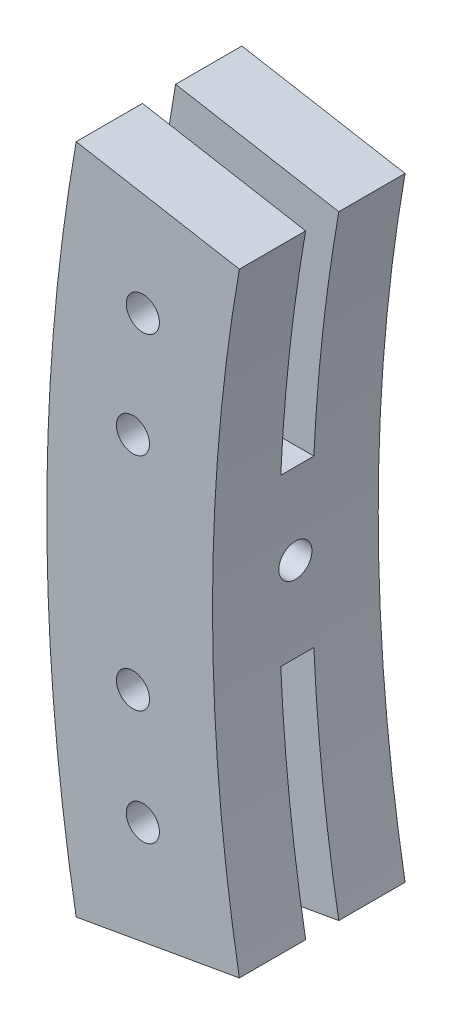
ISO-10303-21;
HEADER;
FILE_DESCRIPTION(('STEP AP214'),'2;1');
FILE_NAME('part.step','',(''),(''),'','','');
FILE_SCHEMA(('AUTOMOTIVE_DESIGN { 1 0 10303 214 1 1 1 1 }'));
ENDSEC;
DATA;
#1=APPLICATION_CONTEXT('core data for automotive mechanical design processes');
#2=APPLICATION_PROTOCOL_DEFINITION('international standard','automotive_design',2000,#1);
#3=PRODUCT_CONTEXT('',#1,'mechanical');
#4=PRODUCT('Part','Part','',(#3));
#5=PRODUCT_RELATED_PRODUCT_CATEGORY('part','',(#4));
#6=PRODUCT_DEFINITION_FORMATION('','',#4);
#7=PRODUCT_DEFINITION_CONTEXT('part definition',#1,'design');
#8=PRODUCT_DEFINITION('design','',#6,#7);
#9=PRODUCT_DEFINITION_SHAPE('','',#8);
#10=(LENGTH_UNIT() NAMED_UNIT(*) SI_UNIT(.MILLI.,.METRE.));
#11=(NAMED_UNIT(*) PLANE_ANGLE_UNIT() SI_UNIT($,.RADIAN.));
#12=(NAMED_UNIT(*) SI_UNIT($,.STERADIAN.) SOLID_ANGLE_UNIT());
#13=UNCERTAINTY_MEASURE_WITH_UNIT(LENGTH_MEASURE(1.E-05),#10,'distance_accuracy_value','');
#14=(GEOMETRIC_REPRESENTATION_CONTEXT(3) GLOBAL_UNCERTAINTY_ASSIGNED_CONTEXT((#13)) GLOBAL_UNIT_ASSIGNED_CONTEXT((#10,
#11,#12)) REPRESENTATION_CONTEXT('',''));
#15=CARTESIAN_POINT('',(0.,0.,0.));
#16=DIRECTION('',(0.,0.,1.));
#17=DIRECTION('',(1.,0.,0.));
#18=AXIS2_PLACEMENT_3D('',#15,#16,#17);
#19=CARTESIAN_POINT('',(0.,0.,-7.5));
#20=DIRECTION('',(0.,0.,1.));
#21=DIRECTION('',(1.,0.,0.));
#22=AXIS2_PLACEMENT_3D('',#19,#20,#21);
#23=PLANE('',#22);
#24=CARTESIAN_POINT('',(-167.20122607206,10.,-7.5));
#25=DIRECTION('',(0.,0.,1.));
#26=DIRECTION('',(1.,0.,0.));
#27=AXIS2_PLACEMENT_3D('',#24,#25,#26);
#28=CIRCLE('',#27,1.5);
#29=CARTESIAN_POINT('',(-165.70122607206,10.,-7.5));
#30=VERTEX_POINT('',#29);
#31=EDGE_CURVE('E139',#30,#30,#28,.T.);
#32=ORIENTED_EDGE('',*,*,#31,.T.);
#33=EDGE_LOOP('',(#32));
#34=FACE_BOUND('',#33,.T.);
#35=CARTESIAN_POINT('',(-167.20122607206,-9.99999999999996,-7.5));
#36=DIRECTION('',(0.,0.,-1.));
#37=DIRECTION('',(-1.,0.,0.));
#38=AXIS2_PLACEMENT_3D('',#35,#36,#37);
#39=CIRCLE('',#38,1.5);
#40=CARTESIAN_POINT('',(-168.70122607206,-9.99999999999996,-7.5));
#41=VERTEX_POINT('',#40);
#42=EDGE_CURVE('E145',#41,#41,#39,.T.);
#43=ORIENTED_EDGE('',*,*,#42,.F.);
#44=EDGE_LOOP('',(#43));
#45=FACE_BOUND('',#44,.T.);
#46=CARTESIAN_POINT('',(-166.306502188652,-19.9598930301715,-7.5));
#47=DIRECTION('',(0.,0.,-1.));
#48=DIRECTION('',(-1.,0.,0.));
#49=AXIS2_PLACEMENT_3D('',#46,#47,#48);
#50=CIRCLE('',#49,1.5);
#51=CARTESIAN_POINT('',(-167.806502188652,-19.9598930301715,-7.5));
#52=VERTEX_POINT('',#51);
#53=EDGE_CURVE('E151',#52,#52,#50,.T.);
#54=ORIENTED_EDGE('',*,*,#53,.F.);
#55=EDGE_LOOP('',(#54));
#56=FACE_BOUND('',#55,.T.);
#57=DIRECTION('',(-0.984807753012208,0.173648177666931,0.));
#58=VECTOR('',#57,1.);
#59=CARTESIAN_POINT('',(0.,0.,-7.5));
#60=LINE('',#59,#58);
#61=CARTESIAN_POINT('',(-157.569240481953,27.7837084267089,-7.5));
#62=VERTEX_POINT('',#61);
#63=CARTESIAN_POINT('',(-172.341356777136,30.3884310917129,-7.5));
#64=VERTEX_POINT('',#63);
#65=EDGE_CURVE('E109',#62,#64,#60,.T.);
#66=ORIENTED_EDGE('',*,*,#65,.F.);
#67=CARTESIAN_POINT('',(0.,0.,-7.5));
#68=DIRECTION('',(0.,0.,1.));
#69=DIRECTION('',(1.,0.,0.));
#70=AXIS2_PLACEMENT_3D('',#67,#68,#69);
#71=CIRCLE('',#70,160.);
#72=CARTESIAN_POINT('',(-157.569240481953,-27.783708426709,-7.5));
#73=VERTEX_POINT('',#72);
#74=EDGE_CURVE('E108',#62,#73,#71,.T.);
#75=ORIENTED_EDGE('',*,*,#74,.T.);
#76=DIRECTION('',(-0.984807753012208,-0.173648177666931,0.));
#77=VECTOR('',#76,1.);
#78=CARTESIAN_POINT('',(0.,0.,-7.5));
#79=LINE('',#78,#77);
#80=CARTESIAN_POINT('',(-172.341356777136,-30.388431091713,-7.5));
#81=VERTEX_POINT('',#80);
#82=EDGE_CURVE('E94',#73,#81,#79,.T.);
#83=ORIENTED_EDGE('',*,*,#82,.T.);
#84=CARTESIAN_POINT('',(0.,0.,-7.5));
#85=DIRECTION('',(0.,0.,1.));
#86=DIRECTION('',(1.,0.,0.));
#87=AXIS2_PLACEMENT_3D('',#84,#85,#86);
#88=CIRCLE('',#87,175.);
#89=EDGE_CURVE('E272',#64,#81,#88,.T.);
#90=ORIENTED_EDGE('',*,*,#89,.F.);
#91=EDGE_LOOP('',(#66,#75,#83,#90));
#92=FACE_BOUND('',#91,.T.);
#93=CARTESIAN_POINT('',(-166.306502188652,19.9598930301716,-7.5));
#94=DIRECTION('',(0.,0.,1.));
#95=DIRECTION('',(1.,0.,0.));
#96=AXIS2_PLACEMENT_3D('',#93,#94,#95);
#97=CIRCLE('',#96,1.5);
#98=CARTESIAN_POINT('',(-164.806502188652,19.9598930301716,-7.5));
#99=VERTEX_POINT('',#98);
#100=EDGE_CURVE('E125',#99,#99,#97,.T.);
#101=ORIENTED_EDGE('',*,*,#100,.T.);
#102=EDGE_LOOP('',(#101));
#103=FACE_BOUND('',#102,.T.);
#104=ADVANCED_FACE('F34',(#34,#45,#56,#92,#103),#23,.F.);
#105=CARTESIAN_POINT('',(0.,0.,7.5));
#106=DIRECTION('',(0.,0.,1.));
#107=DIRECTION('',(1.,0.,0.));
#108=AXIS2_PLACEMENT_3D('',#105,#106,#107);
#109=PLANE('',#108);
#110=CARTESIAN_POINT('',(-167.20122607206,-9.99999999999996,7.5));
#111=DIRECTION('',(0.,0.,-1.));
#112=DIRECTION('',(-1.,0.,0.));
#113=AXIS2_PLACEMENT_3D('',#110,#111,#112);
#114=CIRCLE('',#113,1.5);
#115=CARTESIAN_POINT('',(-168.70122607206,-9.99999999999996,7.5));
#116=VERTEX_POINT('',#115);
#117=EDGE_CURVE('E142',#116,#116,#114,.T.);
#118=ORIENTED_EDGE('',*,*,#117,.T.);
#119=EDGE_LOOP('',(#118));
#120=FACE_BOUND('',#119,.T.);
#121=CARTESIAN_POINT('',(-166.306502188652,-19.9598930301715,7.5));
#122=DIRECTION('',(0.,0.,-1.));
#123=DIRECTION('',(-1.,0.,0.));
#124=AXIS2_PLACEMENT_3D('',#121,#122,#123);
#125=CIRCLE('',#124,1.5);
#126=CARTESIAN_POINT('',(-167.806502188652,-19.9598930301715,7.5));
#127=VERTEX_POINT('',#126);
#128=EDGE_CURVE('E148',#127,#127,#125,.T.);
#129=ORIENTED_EDGE('',*,*,#128,.T.);
#130=EDGE_LOOP('',(#129));
#131=FACE_BOUND('',#130,.T.);
#132=DIRECTION('',(-0.984807753012208,0.173648177666931,0.));
#133=VECTOR('',#132,1.);
#134=CARTESIAN_POINT('',(0.,0.,7.5));
#135=LINE('',#134,#133);
#136=CARTESIAN_POINT('',(-157.569240481953,27.7837084267089,7.5));
#137=VERTEX_POINT('',#136);
#138=CARTESIAN_POINT('',(-172.341356777136,30.3884310917129,7.5));
#139=VERTEX_POINT('',#138);
#140=EDGE_CURVE('E328',#137,#139,#135,.T.);
#141=ORIENTED_EDGE('',*,*,#140,.T.);
#142=CARTESIAN_POINT('',(0.,0.,7.5));
#143=DIRECTION('',(0.,0.,1.));
#144=DIRECTION('',(1.,0.,0.));
#145=AXIS2_PLACEMENT_3D('',#142,#143,#144);
#146=CIRCLE('',#145,175.);
#147=CARTESIAN_POINT('',(-172.341356777136,-30.388431091713,7.5));
#148=VERTEX_POINT('',#147);
#149=EDGE_CURVE('E325',#139,#148,#146,.T.);
#150=ORIENTED_EDGE('',*,*,#149,.T.);
#151=DIRECTION('',(-0.984807753012208,-0.173648177666931,0.));
#152=VECTOR('',#151,1.);
#153=CARTESIAN_POINT('',(0.,0.,7.5));
#154=LINE('',#153,#152);
#155=CARTESIAN_POINT('',(-157.569240481953,-27.783708426709,7.5));
#156=VERTEX_POINT('',#155);
#157=EDGE_CURVE('E322',#156,#148,#154,.T.);
#158=ORIENTED_EDGE('',*,*,#157,.F.);
#159=CARTESIAN_POINT('',(0.,0.,7.5));
#160=DIRECTION('',(0.,0.,1.));
#161=DIRECTION('',(1.,0.,0.));
#162=AXIS2_PLACEMENT_3D('',#159,#160,#161);
#163=CIRCLE('',#162,160.);
#164=EDGE_CURVE('E319',#137,#156,#163,.T.);
#165=ORIENTED_EDGE('',*,*,#164,.F.);
#166=EDGE_LOOP('',(#141,#150,#158,#165));
#167=FACE_BOUND('',#166,.T.);
#168=CARTESIAN_POINT('',(-167.20122607206,10.,7.5));
#169=DIRECTION('',(0.,0.,1.));
#170=DIRECTION('',(1.,0.,0.));
#171=AXIS2_PLACEMENT_3D('',#168,#169,#170);
#172=CIRCLE('',#171,1.5);
#173=CARTESIAN_POINT('',(-165.70122607206,10.,7.5));
#174=VERTEX_POINT('',#173);
#175=EDGE_CURVE('E136',#174,#174,#172,.T.);
#176=ORIENTED_EDGE('',*,*,#175,.F.);
#177=EDGE_LOOP('',(#176));
#178=FACE_BOUND('',#177,.T.);
#179=CARTESIAN_POINT('',(-166.306502188652,19.9598930301716,7.5));
#180=DIRECTION('',(0.,0.,1.));
#181=DIRECTION('',(1.,0.,0.));
#182=AXIS2_PLACEMENT_3D('',#179,#180,#181);
#183=CIRCLE('',#182,1.5);
#184=CARTESIAN_POINT('',(-164.806502188652,19.9598930301716,7.5));
#185=VERTEX_POINT('',#184);
#186=EDGE_CURVE('E131',#185,#185,#183,.T.);
#187=ORIENTED_EDGE('',*,*,#186,.F.);
#188=EDGE_LOOP('',(#187));
#189=FACE_BOUND('',#188,.T.);
#190=ADVANCED_FACE('F216',(#120,#131,#167,#178,#189),#109,.T.);
#191=CARTESIAN_POINT('',(0.,0.,7.5));
#192=DIRECTION('',(0.,0.,-1.));
#193=DIRECTION('',(-1.,0.,0.));
#194=AXIS2_PLACEMENT_3D('',#191,#192,#193);
#195=CYLINDRICAL_SURFACE('',#194,160.);
#196=DIRECTION('',(0.,0.,-1.));
#197=VECTOR('',#196,1.);
#198=CARTESIAN_POINT('',(-157.569240481953,27.7837084267089,7.5));
#199=LINE('',#198,#197);
#200=CARTESIAN_POINT('',(-157.569240481953,27.7837084267089,-1.5));
#201=VERTEX_POINT('',#200);
#202=EDGE_CURVE('E99',#201,#62,#199,.T.);
#203=ORIENTED_EDGE('',*,*,#202,.F.);
#204=CARTESIAN_POINT('',(0.,0.,-1.5));
#205=DIRECTION('',(0.,0.,-1.));
#206=DIRECTION('',(1.,0.,0.));
#207=AXIS2_PLACEMENT_3D('',#204,#205,#206);
#208=CIRCLE('',#207,160.);
#209=CARTESIAN_POINT('',(-159.824122084246,7.5,-1.5));
#210=VERTEX_POINT('',#209);
#211=EDGE_CURVE('E84',#210,#201,#208,.T.);
#212=ORIENTED_EDGE('',*,*,#211,.F.);
#213=DIRECTION('',(0.,0.,-1.));
#214=VECTOR('',#213,1.);
#215=CARTESIAN_POINT('',(-159.824122084246,7.5,1.5));
#216=LINE('',#215,#214);
#217=CARTESIAN_POINT('',(-159.824122084246,7.5,1.5));
#218=VERTEX_POINT('',#217);
#219=EDGE_CURVE('E51',#218,#210,#216,.T.);
#220=ORIENTED_EDGE('',*,*,#219,.F.);
#221=CARTESIAN_POINT('',(0.,0.,1.5));
#222=DIRECTION('',(0.,0.,-1.));
#223=DIRECTION('',(1.,0.,0.));
#224=AXIS2_PLACEMENT_3D('',#221,#222,#223);
#225=CIRCLE('',#224,160.);
#226=CARTESIAN_POINT('',(-157.569240481953,27.7837084267089,1.5));
#227=VERTEX_POINT('',#226);
#228=EDGE_CURVE('E342',#218,#227,#225,.T.);
#229=ORIENTED_EDGE('',*,*,#228,.T.);
#230=DIRECTION('',(0.,0.,-1.));
#231=VECTOR('',#230,1.);
#232=CARTESIAN_POINT('',(-157.569240481953,27.7837084267089,7.5));
#233=LINE('',#232,#231);
#234=EDGE_CURVE('E316',#137,#227,#233,.T.);
#235=ORIENTED_EDGE('',*,*,#234,.F.);
#236=ORIENTED_EDGE('',*,*,#164,.T.);
#237=DIRECTION('',(0.,0.,-1.));
#238=VECTOR('',#237,1.);
#239=CARTESIAN_POINT('',(-157.569240481953,-27.783708426709,7.5));
#240=LINE('',#239,#238);
#241=CARTESIAN_POINT('',(-157.569240481953,-27.783708426709,1.5));
#242=VERTEX_POINT('',#241);
#243=EDGE_CURVE('E313',#156,#242,#240,.T.);
#244=ORIENTED_EDGE('',*,*,#243,.T.);
#245=CARTESIAN_POINT('',(-159.824122084246,-7.5,1.5));
#246=VERTEX_POINT('',#245);
#247=EDGE_CURVE('E341',#242,#246,#225,.T.);
#248=ORIENTED_EDGE('',*,*,#247,.T.);
#249=DIRECTION('',(0.,0.,-1.));
#250=VECTOR('',#249,1.);
#251=CARTESIAN_POINT('',(-159.824122084246,-7.5,1.5));
#252=LINE('',#251,#250);
#253=CARTESIAN_POINT('',(-159.824122084246,-7.5,-1.5));
#254=VERTEX_POINT('',#253);
#255=EDGE_CURVE('E292',#246,#254,#252,.T.);
#256=ORIENTED_EDGE('',*,*,#255,.T.);
#257=CARTESIAN_POINT('',(-157.569240481953,-27.783708426709,-1.5));
#258=VERTEX_POINT('',#257);
#259=EDGE_CURVE('E93',#258,#254,#208,.T.);
#260=ORIENTED_EDGE('',*,*,#259,.F.);
#261=DIRECTION('',(0.,0.,-1.));
#262=VECTOR('',#261,1.);
#263=CARTESIAN_POINT('',(-157.569240481953,-27.783708426709,7.5));
#264=LINE('',#263,#262);
#265=EDGE_CURVE('E116',#258,#73,#264,.T.);
#266=ORIENTED_EDGE('',*,*,#265,.T.);
#267=ORIENTED_EDGE('',*,*,#74,.F.);
#268=EDGE_LOOP('',(#203,#212,#220,#229,#235,#236,#244,#248,#256,#260,#266,#267));
#269=FACE_BOUND('',#268,.T.);
#270=CARTESIAN_POINT('',(-160.,0.,1.5));
#271=CARTESIAN_POINT('',(-159.999999904944,0.0842536721962247,1.49999626440253));
#272=CARTESIAN_POINT('',(-159.999932735344,0.168568389114639,1.49287749868357));
#273=CARTESIAN_POINT('',(-159.999671239699,0.334875615400889,1.46457819211409));
#274=CARTESIAN_POINT('',(-159.99947676072,0.416865207885386,1.44338073831664));
#275=CARTESIAN_POINT('',(-159.998982676871,0.576088753343526,1.38752767341195));
#276=CARTESIAN_POINT('',(-159.998683122338,0.653324962703037,1.35287850569013));
#277=CARTESIAN_POINT('',(-159.998012702952,0.800862402567088,1.27111446429777));
#278=CARTESIAN_POINT('',(-159.997641855805,0.871165348498746,1.22400268480124));
#279=CARTESIAN_POINT('',(-159.996870555532,1.00287484115606,1.11863970523183));
#280=CARTESIAN_POINT('',(-159.996470098501,1.06428021150676,1.06038703454621));
#281=CARTESIAN_POINT('',(-159.995684748927,1.17644201782658,0.9343971369851));
#282=CARTESIAN_POINT('',(-159.995299856996,1.22719803502573,0.866659537303461));
#283=CARTESIAN_POINT('',(-159.994589049793,1.31661748899566,0.723624267477256));
#284=CARTESIAN_POINT('',(-159.994263134508,1.355280928478,0.648326599027925));
#285=CARTESIAN_POINT('',(-159.993707028438,1.41941743457988,0.492308747629321));
#286=CARTESIAN_POINT('',(-159.993476837442,1.44489053029555,0.411588576641808));
#287=CARTESIAN_POINT('',(-159.993138139573,1.4819226771402,0.247019386250639));
#288=CARTESIAN_POINT('',(-159.993029629306,1.49348211643368,0.163170454200742));
#289=CARTESIAN_POINT('',(-159.992946516649,1.50235999085174,-0.00527786977797772));
#290=CARTESIAN_POINT('',(-159.99297191399,1.49967845468218,-0.0898772601937399));
#291=CARTESIAN_POINT('',(-159.993153749331,1.4801508990649,-0.257422354769966));
#292=CARTESIAN_POINT('',(-159.993310183259,1.4633053198898,-0.340368110249689));
#293=CARTESIAN_POINT('',(-159.993736449003,1.41592853180092,-0.502254241268603));
#294=CARTESIAN_POINT('',(-159.994006280953,1.3853973069057,-0.581194612130374));
#295=CARTESIAN_POINT('',(-159.994628926271,1.31151541282607,-0.732830418891023));
#296=CARTESIAN_POINT('',(-159.99498174094,1.26816454282975,-0.805525756942249));
#297=CARTESIAN_POINT('',(-159.995730573422,1.16987412685026,-0.942606802432152));
#298=CARTESIAN_POINT('',(-159.996126591229,1.11493458251241,-1.0069925110506));
#299=CARTESIAN_POINT('',(-159.996917201006,0.995023848278492,-1.12562921357494));
#300=CARTESIAN_POINT('',(-159.99731179292,0.930052271106829,-1.17987981604746));
#301=CARTESIAN_POINT('',(-159.998055049401,0.791923179308349,-1.276703288219));
#302=CARTESIAN_POINT('',(-159.998403713963,0.718765663590688,-1.31927615636187));
#303=CARTESIAN_POINT('',(-159.99901580737,0.566341214518256,-1.39153558771722));
#304=CARTESIAN_POINT('',(-159.999279236141,0.487074275901361,-1.42122213983041));
#305=CARTESIAN_POINT('',(-159.99969115752,0.324681227631279,-1.46686598252397));
#306=CARTESIAN_POINT('',(-159.999839650162,0.241555119160535,-1.48282327731092));
#307=CARTESIAN_POINT('',(-160.000004954249,0.0738068204775503,-1.50055515108832));
#308=CARTESIAN_POINT('',(-160.000021770706,-0.0108153126480393,-1.50233027008926));
#309=CARTESIAN_POINT('',(-159.999921839789,-0.179156474040565,-1.49164880803777));
#310=CARTESIAN_POINT('',(-159.999805092425,-0.262875502372861,-1.47919222801535));
#311=CARTESIAN_POINT('',(-159.999451198988,-0.427032420798721,-1.44040141794759));
#312=CARTESIAN_POINT('',(-159.999214055033,-0.507470368545968,-1.41406743186312));
#313=CARTESIAN_POINT('',(-159.998646103283,-0.662783492923971,-1.34826960400247));
#314=CARTESIAN_POINT('',(-159.998315295482,-0.737658669114568,-1.30880576118739));
#315=CARTESIAN_POINT('',(-159.997597296687,-0.87972326022617,-1.21786708954904));
#316=CARTESIAN_POINT('',(-159.997210103991,-0.94691244296249,-1.16639189801999));
#317=CARTESIAN_POINT('',(-159.99642299237,-1.07169544271992,-1.05289226671891));
#318=CARTESIAN_POINT('',(-159.996023073437,-1.12928925384804,-0.990867820468124));
#319=CARTESIAN_POINT('',(-159.995255582631,-1.23324837660188,-0.858028051319907));
#320=CARTESIAN_POINT('',(-159.994888011769,-1.27961333704126,-0.787212453580795));
#321=CARTESIAN_POINT('',(-159.994226674227,-1.35979615773963,-0.638802104150127));
#322=CARTESIAN_POINT('',(-159.99393290746,-1.39361403271663,-0.561207360410787));
#323=CARTESIAN_POINT('',(-159.993452305011,-1.44774213733926,-0.401442687575194));
#324=CARTESIAN_POINT('',(-159.993265467498,-1.46805259828086,-0.319272836847496));
#325=CARTESIAN_POINT('',(-159.993019782699,-1.49459010555807,-0.152689247847852));
#326=CARTESIAN_POINT('',(-159.99296093561,-1.50081713019733,-0.0682755061192653));
#327=CARTESIAN_POINT('',(-159.992977867514,-1.4990109121179,0.100395850921586));
#328=CARTESIAN_POINT('',(-159.993053641093,-1.49097824274267,0.184653472374667));
#329=CARTESIAN_POINT('',(-159.993331260411,-1.46088179384051,0.350624328793247));
#330=CARTESIAN_POINT('',(-159.993533106404,-1.43881798613141,0.432337558647874));
#331=CARTESIAN_POINT('',(-159.99404011797,-1.38128519908213,0.590901428467188));
#332=CARTESIAN_POINT('',(-159.99434528546,-1.34581597117033,0.667751978234186));
#333=CARTESIAN_POINT('',(-159.995024519557,-1.26248075293009,0.814404625862327));
#334=CARTESIAN_POINT('',(-159.995398583481,-1.21461524560253,0.884206998196997));
#335=CARTESIAN_POINT('',(-159.996173424831,-1.10784974883374,1.01478124547331));
#336=CARTESIAN_POINT('',(-159.996574200484,-1.04895049094879,1.07555371863377));
#337=CARTESIAN_POINT('',(-159.997357411547,-0.921768025455222,1.18636328447704));
#338=CARTESIAN_POINT('',(-159.997739842375,-0.853482489974122,1.23639770612744));
#339=CARTESIAN_POINT('',(-159.998443313166,-0.709452532014542,1.3243119849471));
#340=CARTESIAN_POINT('',(-159.998764322704,-0.633704440970639,1.36218582466075));
#341=CARTESIAN_POINT('',(-159.999308126871,-0.476983912673679,1.424635197545));
#342=CARTESIAN_POINT('',(-159.999531039123,-0.39601786623649,1.44922666473851));
#343=CARTESIAN_POINT('',(-159.999793643638,-0.262113549611693,1.47786268954767));
#344=CARTESIAN_POINT('',(-159.999870693685,-0.21004527121911,1.48615381225777));
#345=CARTESIAN_POINT('',(-159.99997390158,-0.105325948677786,1.4972236351432));
#346=CARTESIAN_POINT('',(-160.000000059428,-0.0526749045454541,1.50000233547375));
#347=CARTESIAN_POINT('',(-160.,0.,1.5));
#348=B_SPLINE_CURVE_WITH_KNOTS('',3,(#270,#271,#272,#273,#274,#275,#276,#277,#278,#279,#280,
#281,#282,#283,#284,#285,#286,#287,#288,#289,#290,#291,#292,#293,#294,#295,#296,#297,#298,#299,
#300,#301,#302,#303,#304,#305,#306,#307,#308,#309,#310,#311,#312,#313,#314,#315,#316,#317,#318,
#319,#320,#321,#322,#323,#324,#325,#326,#327,#328,#329,#330,#331,#332,#333,#334,#335,#336,#337,
#338,#339,#340,#341,#342,#343,#344,#345,#346,#347),.UNSPECIFIED.,.T.,.F.,(4,2,2,2,2,2,2,2,2,2,2,
2,2,2,2,2,2,2,2,2,2,2,2,2,2,2,2,2,2,2,2,2,2,2,2,2,2,2,4),(0.,0.252568752649647,
0.505441470201069,0.758193210600515,1.01088225747498,1.26360468269649,1.51633704398941,
1.76906934861094,2.0218010957364,2.27452579196436,2.52724997876929,2.7799663102302,
3.03268293680212,3.28540352223561,3.53812407178876,3.79085437978098,4.04358472145165,
4.29631528080458,4.5490457627218,4.80176662144978,5.05448746188743,5.30720385971268,
5.55992027753434,5.81264432760232,6.06536853287974,6.31810064117716,6.57083245301346,
6.82355993705213,7.07628781043196,7.32900552254238,7.58172374224948,7.83444664824498,
8.08715970878434,8.33985601994743,8.59261511528825,8.84549909206676,9.09807902229389,
9.25598353808301,9.41388804942585),.UNSPECIFIED.);
#349=CARTESIAN_POINT('',(-160.,0.,1.5));
#350=VERTEX_POINT('',#349);
#351=EDGE_CURVE('E175',#350,#350,#348,.T.);
#352=ORIENTED_EDGE('',*,*,#351,.T.);
#353=EDGE_LOOP('',(#352));
#354=FACE_BOUND('',#353,.T.);
#355=ADVANCED_FACE('F105',(#269,#354),#195,.F.);
#356=CARTESIAN_POINT('',(0.,0.,-1.5));
#357=DIRECTION('',(0.,0.,1.));
#358=DIRECTION('',(1.,0.,0.));
#359=AXIS2_PLACEMENT_3D('',#356,#357,#358);
#360=PLANE('',#359);
#361=CARTESIAN_POINT('',(-166.306502188652,19.9598930301716,-1.5));
#362=DIRECTION('',(0.,0.,1.));
#363=DIRECTION('',(1.,0.,0.));
#364=AXIS2_PLACEMENT_3D('',#361,#362,#363);
#365=CIRCLE('',#364,1.5);
#366=CARTESIAN_POINT('',(-164.806502188652,19.9598930301716,-1.5));
#367=VERTEX_POINT('',#366);
#368=EDGE_CURVE('E156',#367,#367,#365,.T.);
#369=ORIENTED_EDGE('',*,*,#368,.F.);
#370=EDGE_LOOP('',(#369));
#371=FACE_BOUND('',#370,.T.);
#372=CARTESIAN_POINT('',(-167.20122607206,10.,-1.5));
#373=DIRECTION('',(0.,0.,1.));
#374=DIRECTION('',(1.,0.,0.));
#375=AXIS2_PLACEMENT_3D('',#372,#373,#374);
#376=CIRCLE('',#375,1.5);
#377=CARTESIAN_POINT('',(-165.70122607206,10.,-1.5));
#378=VERTEX_POINT('',#377);
#379=EDGE_CURVE('E124',#378,#378,#376,.T.);
#380=ORIENTED_EDGE('',*,*,#379,.F.);
#381=EDGE_LOOP('',(#380));
#382=FACE_BOUND('',#381,.T.);
#383=CARTESIAN_POINT('',(0.,0.,-1.5));
#384=DIRECTION('',(0.,0.,1.));
#385=DIRECTION('',(1.,0.,0.));
#386=AXIS2_PLACEMENT_3D('',#383,#384,#385);
#387=CIRCLE('',#386,175.);
#388=CARTESIAN_POINT('',(-172.341356777136,30.3884310917129,-1.5));
#389=VERTEX_POINT('',#388);
#390=CARTESIAN_POINT('',(-174.839211849059,7.5,-1.5));
#391=VERTEX_POINT('',#390);
#392=EDGE_CURVE('E43',#389,#391,#387,.T.);
#393=ORIENTED_EDGE('',*,*,#392,.T.);
#394=DIRECTION('',(1.,0.,0.));
#395=VECTOR('',#394,1.);
#396=CARTESIAN_POINT('',(0.,7.5,-1.5));
#397=LINE('',#396,#395);
#398=EDGE_CURVE('E90',#391,#210,#397,.T.);
#399=ORIENTED_EDGE('',*,*,#398,.T.);
#400=ORIENTED_EDGE('',*,*,#211,.T.);
#401=DIRECTION('',(-0.984807753012208,0.173648177666931,0.));
#402=VECTOR('',#401,1.);
#403=CARTESIAN_POINT('',(-157.569240481953,27.7837084267089,-1.5));
#404=LINE('',#403,#402);
#405=EDGE_CURVE('E88',#201,#389,#404,.T.);
#406=ORIENTED_EDGE('',*,*,#405,.T.);
#407=EDGE_LOOP('',(#393,#399,#400,#406));
#408=FACE_BOUND('',#407,.T.);
#409=ADVANCED_FACE('F87',(#371,#382,#408),#360,.T.);
#410=CARTESIAN_POINT('',(0.,0.,7.5));
#411=DIRECTION('',(-0.173648177666931,-0.984807753012208,0.));
#412=DIRECTION('',(0.984807753012208,-0.173648177666931,0.));
#413=AXIS2_PLACEMENT_3D('',#410,#411,#412);
#414=PLANE('',#413);
#415=ORIENTED_EDGE('',*,*,#405,.F.);
#416=ORIENTED_EDGE('',*,*,#202,.T.);
#417=ORIENTED_EDGE('',*,*,#65,.T.);
#418=DIRECTION('',(0.,0.,-1.));
#419=VECTOR('',#418,1.);
#420=CARTESIAN_POINT('',(-172.341356777136,30.3884310917129,7.5));
#421=LINE('',#420,#419);
#422=EDGE_CURVE('E101',#389,#64,#421,.T.);
#423=ORIENTED_EDGE('',*,*,#422,.F.);
#424=EDGE_LOOP('',(#415,#416,#417,#423));
#425=FACE_BOUND('',#424,.T.);
#426=ADVANCED_FACE('F36',(#425),#414,.F.);
#427=CARTESIAN_POINT('',(0.,0.,7.5));
#428=DIRECTION('',(0.,0.,-1.));
#429=DIRECTION('',(-1.,0.,0.));
#430=AXIS2_PLACEMENT_3D('',#427,#428,#429);
#431=CYLINDRICAL_SURFACE('',#430,175.);
#432=ORIENTED_EDGE('',*,*,#392,.F.);
#433=ORIENTED_EDGE('',*,*,#422,.T.);
#434=ORIENTED_EDGE('',*,*,#89,.T.);
#435=DIRECTION('',(0.,0.,-1.));
#436=VECTOR('',#435,1.);
#437=CARTESIAN_POINT('',(-172.341356777136,-30.388431091713,7.5));
#438=LINE('',#437,#436);
#439=CARTESIAN_POINT('',(-172.341356777136,-30.388431091713,-1.5));
#440=VERTEX_POINT('',#439);
#441=EDGE_CURVE('E276',#440,#81,#438,.T.);
#442=ORIENTED_EDGE('',*,*,#441,.F.);
#443=CARTESIAN_POINT('',(-174.839211849059,-7.5,-1.5));
#444=VERTEX_POINT('',#443);
#445=EDGE_CURVE('E102',#444,#440,#387,.T.);
#446=ORIENTED_EDGE('',*,*,#445,.F.);
#447=DIRECTION('',(0.,0.,-1.));
#448=VECTOR('',#447,1.);
#449=CARTESIAN_POINT('',(-174.839211849059,-7.5,1.5));
#450=LINE('',#449,#448);
#451=CARTESIAN_POINT('',(-174.839211849059,-7.5,1.5));
#452=VERTEX_POINT('',#451);
#453=EDGE_CURVE('E296',#452,#444,#450,.T.);
#454=ORIENTED_EDGE('',*,*,#453,.F.);
#455=CARTESIAN_POINT('',(0.,0.,1.5));
#456=DIRECTION('',(0.,0.,1.));
#457=DIRECTION('',(1.,0.,0.));
#458=AXIS2_PLACEMENT_3D('',#455,#456,#457);
#459=CIRCLE('',#458,175.);
#460=CARTESIAN_POINT('',(-172.341356777136,-30.388431091713,1.5));
#461=VERTEX_POINT('',#460);
#462=EDGE_CURVE('E337',#452,#461,#459,.T.);
#463=ORIENTED_EDGE('',*,*,#462,.T.);
#464=DIRECTION('',(0.,0.,-1.));
#465=VECTOR('',#464,1.);
#466=CARTESIAN_POINT('',(-172.341356777136,-30.388431091713,7.5));
#467=LINE('',#466,#465);
#468=EDGE_CURVE('E310',#148,#461,#467,.T.);
#469=ORIENTED_EDGE('',*,*,#468,.F.);
#470=ORIENTED_EDGE('',*,*,#149,.F.);
#471=DIRECTION('',(0.,0.,-1.));
#472=VECTOR('',#471,1.);
#473=CARTESIAN_POINT('',(-172.341356777136,30.3884310917129,7.5));
#474=LINE('',#473,#472);
#475=CARTESIAN_POINT('',(-172.341356777136,30.3884310917129,1.5));
#476=VERTEX_POINT('',#475);
#477=EDGE_CURVE('E304',#139,#476,#474,.T.);
#478=ORIENTED_EDGE('',*,*,#477,.T.);
#479=CARTESIAN_POINT('',(-174.839211849059,7.5,1.5));
#480=VERTEX_POINT('',#479);
#481=EDGE_CURVE('E334',#476,#480,#459,.T.);
#482=ORIENTED_EDGE('',*,*,#481,.T.);
#483=DIRECTION('',(0.,0.,-1.));
#484=VECTOR('',#483,1.);
#485=CARTESIAN_POINT('',(-174.839211849059,7.5,1.5));
#486=LINE('',#485,#484);
#487=EDGE_CURVE('E112',#480,#391,#486,.T.);
#488=ORIENTED_EDGE('',*,*,#487,.T.);
#489=EDGE_LOOP('',(#432,#433,#434,#442,#446,#454,#463,#469,#470,#478,#482,#488));
#490=FACE_BOUND('',#489,.T.);
#491=ADVANCED_FACE('F243',(#490),#431,.T.);
#492=CARTESIAN_POINT('',(0.,0.,7.5));
#493=DIRECTION('',(0.173648177666931,-0.984807753012208,0.));
#494=DIRECTION('',(0.984807753012208,0.173648177666931,0.));
#495=AXIS2_PLACEMENT_3D('',#492,#493,#494);
#496=PLANE('',#495);
#497=ORIENTED_EDGE('',*,*,#265,.F.);
#498=DIRECTION('',(0.984807753012208,0.173648177666931,0.));
#499=VECTOR('',#498,1.);
#500=CARTESIAN_POINT('',(-157.569240481953,-27.783708426709,-1.5));
#501=LINE('',#500,#499);
#502=EDGE_CURVE('E11',#440,#258,#501,.T.);
#503=ORIENTED_EDGE('',*,*,#502,.F.);
#504=ORIENTED_EDGE('',*,*,#441,.T.);
#505=ORIENTED_EDGE('',*,*,#82,.F.);
#506=EDGE_LOOP('',(#497,#503,#504,#505));
#507=FACE_BOUND('',#506,.T.);
#508=ADVANCED_FACE('F238',(#507),#496,.T.);
#509=CARTESIAN_POINT('',(-167.20122607206,-9.99999999999996,-1.5));
#510=DIRECTION('',(0.,0.,1.));
#511=DIRECTION('',(1.,0.,0.));
#512=AXIS2_PLACEMENT_3D('',#509,#510,#511);
#513=CIRCLE('',#512,1.5);
#514=CARTESIAN_POINT('',(-165.70122607206,-9.99999999999996,-1.5));
#515=VERTEX_POINT('',#514);
#516=EDGE_CURVE('E168',#515,#515,#513,.F.);
#517=ORIENTED_EDGE('',*,*,#516,.T.);
#518=EDGE_LOOP('',(#517));
#519=FACE_BOUND('',#518,.T.);
#520=CARTESIAN_POINT('',(-166.306502188652,-19.9598930301715,-1.5));
#521=DIRECTION('',(0.,0.,1.));
#522=DIRECTION('',(1.,0.,0.));
#523=AXIS2_PLACEMENT_3D('',#520,#521,#522);
#524=CIRCLE('',#523,1.5);
#525=CARTESIAN_POINT('',(-164.806502188652,-19.9598930301715,-1.5));
#526=VERTEX_POINT('',#525);
#527=EDGE_CURVE('E162',#526,#526,#524,.F.);
#528=ORIENTED_EDGE('',*,*,#527,.T.);
#529=EDGE_LOOP('',(#528));
#530=FACE_BOUND('',#529,.T.);
#531=DIRECTION('',(1.,0.,0.));
#532=VECTOR('',#531,1.);
#533=CARTESIAN_POINT('',(0.,-7.5,-1.5));
#534=LINE('',#533,#532);
#535=EDGE_CURVE('E285',#444,#254,#534,.T.);
#536=ORIENTED_EDGE('',*,*,#535,.F.);
#537=ORIENTED_EDGE('',*,*,#445,.T.);
#538=ORIENTED_EDGE('',*,*,#502,.T.);
#539=ORIENTED_EDGE('',*,*,#259,.T.);
#540=EDGE_LOOP('',(#536,#537,#538,#539));
#541=FACE_BOUND('',#540,.T.);
#542=ADVANCED_FACE('F234',(#519,#530,#541),#360,.T.);
#543=CARTESIAN_POINT('',(0.,7.5,1.5));
#544=DIRECTION('',(0.,1.,0.));
#545=DIRECTION('',(0.,0.,1.));
#546=AXIS2_PLACEMENT_3D('',#543,#544,#545);
#547=PLANE('',#546);
#548=ORIENTED_EDGE('',*,*,#398,.F.);
#549=ORIENTED_EDGE('',*,*,#487,.F.);
#550=DIRECTION('',(1.,0.,0.));
#551=VECTOR('',#550,1.);
#552=CARTESIAN_POINT('',(0.,7.5,1.5));
#553=LINE('',#552,#551);
#554=EDGE_CURVE('E302',#480,#218,#553,.T.);
#555=ORIENTED_EDGE('',*,*,#554,.T.);
#556=ORIENTED_EDGE('',*,*,#219,.T.);
#557=EDGE_LOOP('',(#548,#549,#555,#556));
#558=FACE_BOUND('',#557,.T.);
#559=ADVANCED_FACE('F230',(#558),#547,.T.);
#560=CARTESIAN_POINT('',(0.,-7.5,1.5));
#561=DIRECTION('',(0.,1.,0.));
#562=DIRECTION('',(0.,0.,1.));
#563=AXIS2_PLACEMENT_3D('',#560,#561,#562);
#564=PLANE('',#563);
#565=ORIENTED_EDGE('',*,*,#535,.T.);
#566=ORIENTED_EDGE('',*,*,#255,.F.);
#567=DIRECTION('',(1.,0.,0.));
#568=VECTOR('',#567,1.);
#569=CARTESIAN_POINT('',(0.,-7.5,1.5));
#570=LINE('',#569,#568);
#571=EDGE_CURVE('E300',#452,#246,#570,.T.);
#572=ORIENTED_EDGE('',*,*,#571,.F.);
#573=ORIENTED_EDGE('',*,*,#453,.T.);
#574=EDGE_LOOP('',(#565,#566,#572,#573));
#575=FACE_BOUND('',#574,.T.);
#576=ADVANCED_FACE('F227',(#575),#564,.F.);
#577=CARTESIAN_POINT('',(0.,0.,1.5));
#578=DIRECTION('',(0.,0.,1.));
#579=DIRECTION('',(1.,0.,0.));
#580=AXIS2_PLACEMENT_3D('',#577,#578,#579);
#581=PLANE('',#580);
#582=CARTESIAN_POINT('',(-167.20122607206,-9.99999999999996,1.5));
#583=DIRECTION('',(0.,0.,1.));
#584=DIRECTION('',(1.,0.,0.));
#585=AXIS2_PLACEMENT_3D('',#582,#583,#584);
#586=CIRCLE('',#585,1.5);
#587=CARTESIAN_POINT('',(-165.70122607206,-9.99999999999996,1.5));
#588=VERTEX_POINT('',#587);
#589=EDGE_CURVE('E165',#588,#588,#586,.F.);
#590=ORIENTED_EDGE('',*,*,#589,.F.);
#591=EDGE_LOOP('',(#590));
#592=FACE_BOUND('',#591,.T.);
#593=CARTESIAN_POINT('',(-166.306502188652,-19.9598930301715,1.5));
#594=DIRECTION('',(0.,0.,1.));
#595=DIRECTION('',(1.,0.,0.));
#596=AXIS2_PLACEMENT_3D('',#593,#594,#595);
#597=CIRCLE('',#596,1.5);
#598=CARTESIAN_POINT('',(-164.806502188652,-19.9598930301715,1.5));
#599=VERTEX_POINT('',#598);
#600=EDGE_CURVE('E159',#599,#599,#597,.F.);
#601=ORIENTED_EDGE('',*,*,#600,.F.);
#602=EDGE_LOOP('',(#601));
#603=FACE_BOUND('',#602,.T.);
#604=ORIENTED_EDGE('',*,*,#462,.F.);
#605=ORIENTED_EDGE('',*,*,#571,.T.);
#606=ORIENTED_EDGE('',*,*,#247,.F.);
#607=DIRECTION('',(0.984807753012208,0.173648177666931,0.));
#608=VECTOR('',#607,1.);
#609=CARTESIAN_POINT('',(-157.569240481953,-27.783708426709,1.5));
#610=LINE('',#609,#608);
#611=EDGE_CURVE('E331',#461,#242,#610,.T.);
#612=ORIENTED_EDGE('',*,*,#611,.F.);
#613=EDGE_LOOP('',(#604,#605,#606,#612));
#614=FACE_BOUND('',#613,.T.);
#615=ADVANCED_FACE('F215',(#592,#603,#614),#581,.F.);
#616=CARTESIAN_POINT('',(0.,0.,7.5));
#617=DIRECTION('',(0.173648177666931,-0.984807753012208,0.));
#618=DIRECTION('',(0.984807753012208,0.173648177666931,0.));
#619=AXIS2_PLACEMENT_3D('',#616,#617,#618);
#620=PLANE('',#619);
#621=ORIENTED_EDGE('',*,*,#611,.T.);
#622=ORIENTED_EDGE('',*,*,#243,.F.);
#623=ORIENTED_EDGE('',*,*,#157,.T.);
#624=ORIENTED_EDGE('',*,*,#468,.T.);
#625=EDGE_LOOP('',(#621,#622,#623,#624));
#626=FACE_BOUND('',#625,.T.);
#627=ADVANCED_FACE('F220',(#626),#620,.T.);
#628=CARTESIAN_POINT('',(0.,0.,7.5));
#629=DIRECTION('',(-0.173648177666931,-0.984807753012208,0.));
#630=DIRECTION('',(0.984807753012208,-0.173648177666931,0.));
#631=AXIS2_PLACEMENT_3D('',#628,#629,#630);
#632=PLANE('',#631);
#633=ORIENTED_EDGE('',*,*,#234,.T.);
#634=DIRECTION('',(-0.984807753012208,0.173648177666931,0.));
#635=VECTOR('',#634,1.);
#636=CARTESIAN_POINT('',(-157.569240481953,27.7837084267089,1.5));
#637=LINE('',#636,#635);
#638=EDGE_CURVE('E338',#227,#476,#637,.T.);
#639=ORIENTED_EDGE('',*,*,#638,.T.);
#640=ORIENTED_EDGE('',*,*,#477,.F.);
#641=ORIENTED_EDGE('',*,*,#140,.F.);
#642=EDGE_LOOP('',(#633,#639,#640,#641));
#643=FACE_BOUND('',#642,.T.);
#644=ADVANCED_FACE('F213',(#643),#632,.F.);
#645=CARTESIAN_POINT('',(-166.306502188652,19.9598930301716,1.5));
#646=DIRECTION('',(0.,0.,1.));
#647=DIRECTION('',(1.,0.,0.));
#648=AXIS2_PLACEMENT_3D('',#645,#646,#647);
#649=CIRCLE('',#648,1.5);
#650=CARTESIAN_POINT('',(-164.806502188652,19.9598930301716,1.5));
#651=VERTEX_POINT('',#650);
#652=EDGE_CURVE('E38',#651,#651,#649,.T.);
#653=ORIENTED_EDGE('',*,*,#652,.T.);
#654=EDGE_LOOP('',(#653));
#655=FACE_BOUND('',#654,.T.);
#656=CARTESIAN_POINT('',(-167.20122607206,10.,1.5));
#657=DIRECTION('',(0.,0.,1.));
#658=DIRECTION('',(1.,0.,0.));
#659=AXIS2_PLACEMENT_3D('',#656,#657,#658);
#660=CIRCLE('',#659,1.5);
#661=CARTESIAN_POINT('',(-165.70122607206,10.,1.5));
#662=VERTEX_POINT('',#661);
#663=EDGE_CURVE('E122',#662,#662,#660,.T.);
#664=ORIENTED_EDGE('',*,*,#663,.T.);
#665=EDGE_LOOP('',(#664));
#666=FACE_BOUND('',#665,.T.);
#667=ORIENTED_EDGE('',*,*,#554,.F.);
#668=ORIENTED_EDGE('',*,*,#481,.F.);
#669=ORIENTED_EDGE('',*,*,#638,.F.);
#670=ORIENTED_EDGE('',*,*,#228,.F.);
#671=EDGE_LOOP('',(#667,#668,#669,#670));
#672=FACE_BOUND('',#671,.T.);
#673=ADVANCED_FACE('F210',(#655,#666,#672),#581,.F.);
#674=CARTESIAN_POINT('',(-157.569240481953,0.,0.));
#675=DIRECTION('',(-1.,0.,0.));
#676=DIRECTION('',(0.,0.,1.));
#677=AXIS2_PLACEMENT_3D('',#674,#675,#676);
#678=CYLINDRICAL_SURFACE('',#677,1.5);
#679=ORIENTED_EDGE('',*,*,#351,.F.);
#680=EDGE_LOOP('',(#679));
#681=FACE_BOUND('',#680,.T.);
#682=CARTESIAN_POINT('',(-166.25,0.,0.));
#683=DIRECTION('',(1.,0.,0.));
#684=DIRECTION('',(0.,0.,-1.));
#685=AXIS2_PLACEMENT_3D('',#682,#683,#684);
#686=CIRCLE('',#685,1.5);
#687=CARTESIAN_POINT('',(-166.25,0.,-1.5));
#688=VERTEX_POINT('',#687);
#689=EDGE_CURVE('E118',#688,#688,#686,.F.);
#690=ORIENTED_EDGE('',*,*,#689,.T.);
#691=EDGE_LOOP('',(#690));
#692=FACE_BOUND('',#691,.T.);
#693=ADVANCED_FACE('F197',(#681,#692),#678,.F.);
#694=CARTESIAN_POINT('',(-168.75,0.,0.));
#695=DIRECTION('',(1.,0.,0.));
#696=DIRECTION('',(0.,0.,-1.));
#697=AXIS2_PLACEMENT_3D('',#694,#695,#696);
#698=CYLINDRICAL_SURFACE('',#697,3.);
#699=CARTESIAN_POINT('',(-168.75,0.,0.));
#700=DIRECTION('',(1.,0.,0.));
#701=DIRECTION('',(0.,0.,-1.));
#702=AXIS2_PLACEMENT_3D('',#699,#700,#701);
#703=CIRCLE('',#702,3.);
#704=CARTESIAN_POINT('',(-168.75,0.,-3.));
#705=VERTEX_POINT('',#704);
#706=EDGE_CURVE('E184',#705,#705,#703,.T.);
#707=ORIENTED_EDGE('',*,*,#706,.F.);
#708=EDGE_LOOP('',(#707));
#709=FACE_BOUND('',#708,.T.);
#710=CARTESIAN_POINT('',(-166.25,0.,0.));
#711=DIRECTION('',(1.,0.,0.));
#712=DIRECTION('',(0.,0.,-1.));
#713=AXIS2_PLACEMENT_3D('',#710,#711,#712);
#714=CIRCLE('',#713,3.);
#715=CARTESIAN_POINT('',(-166.25,0.,-3.));
#716=VERTEX_POINT('',#715);
#717=EDGE_CURVE('E183',#716,#716,#714,.T.);
#718=ORIENTED_EDGE('',*,*,#717,.T.);
#719=EDGE_LOOP('',(#718));
#720=FACE_BOUND('',#719,.T.);
#721=ADVANCED_FACE('F202',(#709,#720),#698,.F.);
#722=CARTESIAN_POINT('',(-168.75,0.,0.));
#723=DIRECTION('',(1.,0.,0.));
#724=DIRECTION('',(0.,0.,-1.));
#725=AXIS2_PLACEMENT_3D('',#722,#723,#724);
#726=PLANE('',#725);
#727=CARTESIAN_POINT('',(-168.75,0.,0.));
#728=DIRECTION('',(1.,0.,0.));
#729=DIRECTION('',(0.,0.,-1.));
#730=AXIS2_PLACEMENT_3D('',#727,#728,#729);
#731=CIRCLE('',#730,1.5);
#732=CARTESIAN_POINT('',(-168.75,0.,-1.5));
#733=VERTEX_POINT('',#732);
#734=EDGE_CURVE('E120',#733,#733,#731,.F.);
#735=ORIENTED_EDGE('',*,*,#734,.T.);
#736=EDGE_LOOP('',(#735));
#737=FACE_BOUND('',#736,.T.);
#738=ORIENTED_EDGE('',*,*,#706,.T.);
#739=EDGE_LOOP('',(#738));
#740=FACE_BOUND('',#739,.T.);
#741=ADVANCED_FACE('F199',(#737,#740),#726,.T.);
#742=CARTESIAN_POINT('',(-166.25,0.,0.));
#743=DIRECTION('',(1.,0.,0.));
#744=DIRECTION('',(0.,0.,-1.));
#745=AXIS2_PLACEMENT_3D('',#742,#743,#744);
#746=PLANE('',#745);
#747=ORIENTED_EDGE('',*,*,#689,.F.);
#748=EDGE_LOOP('',(#747));
#749=FACE_BOUND('',#748,.T.);
#750=ORIENTED_EDGE('',*,*,#717,.F.);
#751=EDGE_LOOP('',(#750));
#752=FACE_BOUND('',#751,.T.);
#753=ADVANCED_FACE('F195',(#749,#752),#746,.F.);
#754=ORIENTED_EDGE('',*,*,#734,.F.);
#755=EDGE_LOOP('',(#754));
#756=FACE_BOUND('',#755,.T.);
#757=CARTESIAN_POINT('',(-170.,0.,0.));
#758=DIRECTION('',(1.,0.,0.));
#759=DIRECTION('',(0.,0.,-1.));
#760=AXIS2_PLACEMENT_3D('',#757,#758,#759);
#761=CIRCLE('',#760,1.5);
#762=CARTESIAN_POINT('',(-170.,0.,-1.5));
#763=VERTEX_POINT('',#762);
#764=EDGE_CURVE('E121',#763,#763,#761,.T.);
#765=ORIENTED_EDGE('',*,*,#764,.F.);
#766=EDGE_LOOP('',(#765));
#767=FACE_BOUND('',#766,.T.);
#768=ADVANCED_FACE('F189',(#756,#767),#678,.F.);
#769=CARTESIAN_POINT('',(-170.,0.,0.));
#770=DIRECTION('',(1.,0.,0.));
#771=DIRECTION('',(0.,0.,-1.));
#772=AXIS2_PLACEMENT_3D('',#769,#770,#771);
#773=PLANE('',#772);
#774=ORIENTED_EDGE('',*,*,#764,.T.);
#775=EDGE_LOOP('',(#774));
#776=FACE_BOUND('',#775,.T.);
#777=ADVANCED_FACE('F194',(#776),#773,.T.);
#778=CARTESIAN_POINT('',(-167.20122607206,10.,-7.5));
#779=DIRECTION('',(0.,0.,1.));
#780=DIRECTION('',(1.,0.,0.));
#781=AXIS2_PLACEMENT_3D('',#778,#779,#780);
#782=CYLINDRICAL_SURFACE('',#781,1.5);
#783=ORIENTED_EDGE('',*,*,#175,.T.);
#784=EDGE_LOOP('',(#783));
#785=FACE_BOUND('',#784,.T.);
#786=ORIENTED_EDGE('',*,*,#663,.F.);
#787=EDGE_LOOP('',(#786));
#788=FACE_BOUND('',#787,.T.);
#789=ADVANCED_FACE('F262',(#785,#788),#782,.F.);
#790=CARTESIAN_POINT('',(-166.306502188652,19.9598930301716,-7.5));
#791=DIRECTION('',(0.,0.,1.));
#792=DIRECTION('',(1.,0.,0.));
#793=AXIS2_PLACEMENT_3D('',#790,#791,#792);
#794=CYLINDRICAL_SURFACE('',#793,1.5);
#795=ORIENTED_EDGE('',*,*,#186,.T.);
#796=EDGE_LOOP('',(#795));
#797=FACE_BOUND('',#796,.T.);
#798=ORIENTED_EDGE('',*,*,#652,.F.);
#799=EDGE_LOOP('',(#798));
#800=FACE_BOUND('',#799,.T.);
#801=ADVANCED_FACE('F408',(#797,#800),#794,.F.);
#802=CARTESIAN_POINT('',(-166.306502188652,-19.9598930301715,-7.5));
#803=DIRECTION('',(0.,0.,1.));
#804=DIRECTION('',(1.,0.,0.));
#805=AXIS2_PLACEMENT_3D('',#802,#803,#804);
#806=CYLINDRICAL_SURFACE('',#805,1.5);
#807=ORIENTED_EDGE('',*,*,#128,.F.);
#808=EDGE_LOOP('',(#807));
#809=FACE_BOUND('',#808,.T.);
#810=ORIENTED_EDGE('',*,*,#600,.T.);
#811=EDGE_LOOP('',(#810));
#812=FACE_BOUND('',#811,.T.);
#813=ADVANCED_FACE('F405',(#809,#812),#806,.F.);
#814=CARTESIAN_POINT('',(-167.20122607206,-9.99999999999996,-7.5));
#815=DIRECTION('',(0.,0.,1.));
#816=DIRECTION('',(1.,0.,0.));
#817=AXIS2_PLACEMENT_3D('',#814,#815,#816);
#818=CYLINDRICAL_SURFACE('',#817,1.5);
#819=ORIENTED_EDGE('',*,*,#117,.F.);
#820=EDGE_LOOP('',(#819));
#821=FACE_BOUND('',#820,.T.);
#822=ORIENTED_EDGE('',*,*,#589,.T.);
#823=EDGE_LOOP('',(#822));
#824=FACE_BOUND('',#823,.T.);
#825=ADVANCED_FACE('F407',(#821,#824),#818,.F.);
#826=ORIENTED_EDGE('',*,*,#527,.F.);
#827=EDGE_LOOP('',(#826));
#828=FACE_BOUND('',#827,.T.);
#829=ORIENTED_EDGE('',*,*,#53,.T.);
#830=EDGE_LOOP('',(#829));
#831=FACE_BOUND('',#830,.T.);
#832=ADVANCED_FACE('F410',(#828,#831),#806,.F.);
#833=ORIENTED_EDGE('',*,*,#516,.F.);
#834=EDGE_LOOP('',(#833));
#835=FACE_BOUND('',#834,.T.);
#836=ORIENTED_EDGE('',*,*,#42,.T.);
#837=EDGE_LOOP('',(#836));
#838=FACE_BOUND('',#837,.T.);
#839=ADVANCED_FACE('F260',(#835,#838),#818,.F.);
#840=ORIENTED_EDGE('',*,*,#379,.T.);
#841=EDGE_LOOP('',(#840));
#842=FACE_BOUND('',#841,.T.);
#843=ORIENTED_EDGE('',*,*,#31,.F.);
#844=EDGE_LOOP('',(#843));
#845=FACE_BOUND('',#844,.T.);
#846=ADVANCED_FACE('F256',(#842,#845),#782,.F.);
#847=ORIENTED_EDGE('',*,*,#368,.T.);
#848=EDGE_LOOP('',(#847));
#849=FACE_BOUND('',#848,.T.);
#850=ORIENTED_EDGE('',*,*,#100,.F.);
#851=EDGE_LOOP('',(#850));
#852=FACE_BOUND('',#851,.T.);
#853=ADVANCED_FACE('F259',(#849,#852),#794,.F.);
#854=CLOSED_SHELL('',(#104,#190,#355,#409,#426,#491,#508,#542,#559,#576,#615,#627,#644,#673,
#693,#721,#741,#753,#768,#777,#789,#801,#813,#825,#832,#839,#846,#853));
#855=MANIFOLD_SOLID_BREP('B2',#854);
#856=ADVANCED_BREP_SHAPE_REPRESENTATION('',(#18,#855),#14);
#857=SHAPE_DEFINITION_REPRESENTATION(#9,#856);
ENDSEC;
END-ISO-10303-21;
